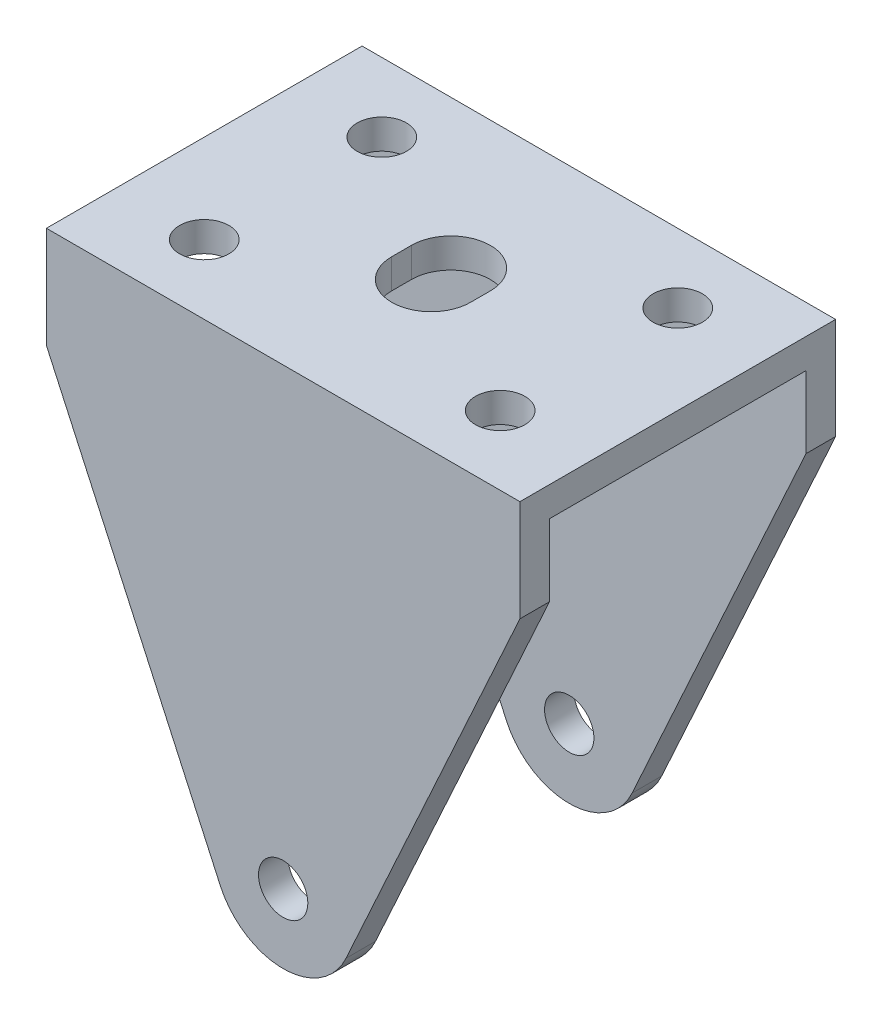
ISO-10303-21;
HEADER;
FILE_DESCRIPTION(('STEP AP214'),'2;1');
FILE_NAME('part.step','',(''),(''),'','','');
FILE_SCHEMA(('AUTOMOTIVE_DESIGN { 1 0 10303 214 1 1 1 1 }'));
ENDSEC;
DATA;
#1=APPLICATION_CONTEXT('core data for automotive mechanical design processes');
#2=APPLICATION_PROTOCOL_DEFINITION('international standard','automotive_design',2000,#1);
#3=PRODUCT_CONTEXT('',#1,'mechanical');
#4=PRODUCT('Part','Part','',(#3));
#5=PRODUCT_RELATED_PRODUCT_CATEGORY('part','',(#4));
#6=PRODUCT_DEFINITION_FORMATION('','',#4);
#7=PRODUCT_DEFINITION_CONTEXT('part definition',#1,'design');
#8=PRODUCT_DEFINITION('design','',#6,#7);
#9=PRODUCT_DEFINITION_SHAPE('','',#8);
#10=(LENGTH_UNIT() NAMED_UNIT(*) SI_UNIT(.MILLI.,.METRE.));
#11=(NAMED_UNIT(*) PLANE_ANGLE_UNIT() SI_UNIT($,.RADIAN.));
#12=(NAMED_UNIT(*) SI_UNIT($,.STERADIAN.) SOLID_ANGLE_UNIT());
#13=UNCERTAINTY_MEASURE_WITH_UNIT(LENGTH_MEASURE(1.E-05),#10,'distance_accuracy_value','');
#14=(GEOMETRIC_REPRESENTATION_CONTEXT(3) GLOBAL_UNCERTAINTY_ASSIGNED_CONTEXT((#13)) GLOBAL_UNIT_ASSIGNED_CONTEXT((#10,
#11,#12)) REPRESENTATION_CONTEXT('',''));
#15=CARTESIAN_POINT('',(0.,0.,0.));
#16=DIRECTION('',(0.,0.,1.));
#17=DIRECTION('',(1.,0.,0.));
#18=AXIS2_PLACEMENT_3D('',#15,#16,#17);
#19=CARTESIAN_POINT('',(24.,-3.,-16.));
#20=DIRECTION('',(0.,0.,-1.));
#21=DIRECTION('',(-1.,0.,0.));
#22=AXIS2_PLACEMENT_3D('',#19,#20,#21);
#23=PLANE('',#22);
#24=CARTESIAN_POINT('',(0.,-46.,-16.));
#25=DIRECTION('',(0.,0.,1.));
#26=DIRECTION('',(1.,0.,0.));
#27=AXIS2_PLACEMENT_3D('',#24,#25,#26);
#28=CIRCLE('',#27,2.5);
#29=CARTESIAN_POINT('',(2.5,-46.,-16.));
#30=VERTEX_POINT('',#29);
#31=EDGE_CURVE('E276',#30,#30,#28,.T.);
#32=ORIENTED_EDGE('',*,*,#31,.T.);
#33=EDGE_LOOP('',(#32));
#34=FACE_BOUND('',#33,.T.);
#35=CARTESIAN_POINT('',(0.,-46.,-16.));
#36=DIRECTION('',(0.,0.,1.));
#37=DIRECTION('',(1.,0.,0.));
#38=AXIS2_PLACEMENT_3D('',#35,#36,#37);
#39=CIRCLE('',#38,7.);
#40=CARTESIAN_POINT('',(-6.36773058240944,-48.9072336042787,-16.));
#41=VERTEX_POINT('',#40);
#42=CARTESIAN_POINT('',(6.36773058240945,-48.9072336042787,-16.));
#43=VERTEX_POINT('',#42);
#44=EDGE_CURVE('E299',#41,#43,#39,.T.);
#45=ORIENTED_EDGE('',*,*,#44,.F.);
#46=DIRECTION('',(0.415319086325528,-0.909675797487066,0.));
#47=VECTOR('',#46,1.);
#48=CARTESIAN_POINT('',(-23.746793751389,-10.8417710037272,-16.));
#49=LINE('',#48,#47);
#50=CARTESIAN_POINT('',(-24.,-10.2871718925432,-16.));
#51=VERTEX_POINT('',#50);
#52=EDGE_CURVE('E269',#51,#41,#49,.T.);
#53=ORIENTED_EDGE('',*,*,#52,.F.);
#54=DIRECTION('',(0.,1.,0.));
#55=VECTOR('',#54,1.);
#56=CARTESIAN_POINT('',(-24.,-3.,-16.));
#57=LINE('',#56,#55);
#58=CARTESIAN_POINT('',(-24.,0.,-16.));
#59=VERTEX_POINT('',#58);
#60=EDGE_CURVE('E366',#51,#59,#57,.T.);
#61=ORIENTED_EDGE('',*,*,#60,.T.);
#62=DIRECTION('',(-1.,0.,0.));
#63=VECTOR('',#62,1.);
#64=CARTESIAN_POINT('',(24.,0.,-16.));
#65=LINE('',#64,#63);
#66=CARTESIAN_POINT('',(24.,0.,-16.));
#67=VERTEX_POINT('',#66);
#68=EDGE_CURVE('E352',#67,#59,#65,.T.);
#69=ORIENTED_EDGE('',*,*,#68,.F.);
#70=DIRECTION('',(0.,1.,0.));
#71=VECTOR('',#70,1.);
#72=CARTESIAN_POINT('',(24.,-3.,-16.));
#73=LINE('',#72,#71);
#74=CARTESIAN_POINT('',(24.,-10.2871718925432,-16.));
#75=VERTEX_POINT('',#74);
#76=EDGE_CURVE('E368',#75,#67,#73,.T.);
#77=ORIENTED_EDGE('',*,*,#76,.F.);
#78=DIRECTION('',(-0.415319086325528,-0.909675797487066,0.));
#79=VECTOR('',#78,1.);
#80=CARTESIAN_POINT('',(23.746793751389,-10.8417710037272,-16.));
#81=LINE('',#80,#79);
#82=EDGE_CURVE('E301',#75,#43,#81,.T.);
#83=ORIENTED_EDGE('',*,*,#82,.T.);
#84=EDGE_LOOP('',(#45,#53,#61,#69,#77,#83));
#85=FACE_BOUND('',#84,.T.);
#86=ADVANCED_FACE('F93',(#34,#85),#23,.T.);
#87=CARTESIAN_POINT('',(24.,-3.,16.));
#88=DIRECTION('',(0.,0.,1.));
#89=DIRECTION('',(1.,0.,0.));
#90=AXIS2_PLACEMENT_3D('',#87,#88,#89);
#91=PLANE('',#90);
#92=CARTESIAN_POINT('',(0.,-46.,16.));
#93=DIRECTION('',(0.,0.,1.));
#94=DIRECTION('',(1.,0.,0.));
#95=AXIS2_PLACEMENT_3D('',#92,#93,#94);
#96=CIRCLE('',#95,2.5);
#97=CARTESIAN_POINT('',(2.5,-46.,16.));
#98=VERTEX_POINT('',#97);
#99=EDGE_CURVE('E295',#98,#98,#96,.T.);
#100=ORIENTED_EDGE('',*,*,#99,.F.);
#101=EDGE_LOOP('',(#100));
#102=FACE_BOUND('',#101,.T.);
#103=DIRECTION('',(0.415319086325528,-0.909675797487066,0.));
#104=VECTOR('',#103,1.);
#105=CARTESIAN_POINT('',(-24.,-10.2871718925432,16.));
#106=LINE('',#105,#104);
#107=CARTESIAN_POINT('',(-24.,-10.2871718925432,16.));
#108=VERTEX_POINT('',#107);
#109=CARTESIAN_POINT('',(-6.36773058240945,-48.9072336042787,16.));
#110=VERTEX_POINT('',#109);
#111=EDGE_CURVE('E97',#108,#110,#106,.T.);
#112=ORIENTED_EDGE('',*,*,#111,.T.);
#113=CARTESIAN_POINT('',(0.,-46.,16.));
#114=DIRECTION('',(0.,0.,1.));
#115=DIRECTION('',(1.,0.,0.));
#116=AXIS2_PLACEMENT_3D('',#113,#114,#115);
#117=CIRCLE('',#116,7.);
#118=CARTESIAN_POINT('',(6.36773058240945,-48.9072336042787,16.000006));
#119=VERTEX_POINT('',#118);
#120=EDGE_CURVE('E319',#110,#119,#117,.T.);
#121=ORIENTED_EDGE('',*,*,#120,.T.);
#122=DIRECTION('',(-0.415319086325528,-0.909675797487066,0.));
#123=VECTOR('',#122,1.);
#124=CARTESIAN_POINT('',(26.7531352313852,-4.25696386777377,16.));
#125=LINE('',#124,#123);
#126=CARTESIAN_POINT('',(24.,-10.2871718925432,16.));
#127=VERTEX_POINT('',#126);
#128=EDGE_CURVE('E327',#127,#119,#125,.T.);
#129=ORIENTED_EDGE('',*,*,#128,.F.);
#130=DIRECTION('',(0.,1.,0.));
#131=VECTOR('',#130,1.);
#132=CARTESIAN_POINT('',(24.,-3.,16.));
#133=LINE('',#132,#131);
#134=CARTESIAN_POINT('',(24.,0.,16.));
#135=VERTEX_POINT('',#134);
#136=EDGE_CURVE('E370',#127,#135,#133,.T.);
#137=ORIENTED_EDGE('',*,*,#136,.T.);
#138=DIRECTION('',(1.,0.,0.));
#139=VECTOR('',#138,1.);
#140=CARTESIAN_POINT('',(24.,0.,16.));
#141=LINE('',#140,#139);
#142=CARTESIAN_POINT('',(-24.,0.,16.));
#143=VERTEX_POINT('',#142);
#144=EDGE_CURVE('E358',#143,#135,#141,.T.);
#145=ORIENTED_EDGE('',*,*,#144,.F.);
#146=DIRECTION('',(0.,1.,0.));
#147=VECTOR('',#146,1.);
#148=CARTESIAN_POINT('',(-24.,-3.,16.));
#149=LINE('',#148,#147);
#150=EDGE_CURVE('E355',#108,#143,#149,.T.);
#151=ORIENTED_EDGE('',*,*,#150,.F.);
#152=EDGE_LOOP('',(#112,#121,#129,#137,#145,#151));
#153=FACE_BOUND('',#152,.T.);
#154=ADVANCED_FACE('F381',(#102,#153),#91,.T.);
#155=CARTESIAN_POINT('',(-24.,-53.,13.));
#156=DIRECTION('',(0.,0.,1.));
#157=DIRECTION('',(1.,0.,0.));
#158=AXIS2_PLACEMENT_3D('',#155,#156,#157);
#159=PLANE('',#158);
#160=CARTESIAN_POINT('',(0.,-46.,13.));
#161=DIRECTION('',(0.,0.,1.));
#162=DIRECTION('',(1.,0.,0.));
#163=AXIS2_PLACEMENT_3D('',#160,#161,#162);
#164=CIRCLE('',#163,2.5);
#165=CARTESIAN_POINT('',(2.5,-46.,13.));
#166=VERTEX_POINT('',#165);
#167=EDGE_CURVE('E292',#166,#166,#164,.T.);
#168=ORIENTED_EDGE('',*,*,#167,.T.);
#169=EDGE_LOOP('',(#168));
#170=FACE_BOUND('',#169,.T.);
#171=CARTESIAN_POINT('',(0.,-46.,13.));
#172=DIRECTION('',(0.,0.,1.));
#173=DIRECTION('',(1.,0.,0.));
#174=AXIS2_PLACEMENT_3D('',#171,#172,#173);
#175=CIRCLE('',#174,7.);
#176=CARTESIAN_POINT('',(-6.36773058240944,-48.9072336042787,13.));
#177=VERTEX_POINT('',#176);
#178=CARTESIAN_POINT('',(6.36773058240945,-48.9072336042787,13.));
#179=VERTEX_POINT('',#178);
#180=EDGE_CURVE('E317',#177,#179,#175,.T.);
#181=ORIENTED_EDGE('',*,*,#180,.F.);
#182=DIRECTION('',(0.415319086325528,-0.909675797487066,0.));
#183=VECTOR('',#182,1.);
#184=CARTESIAN_POINT('',(-7.86284917814653,-45.6324666944602,13.));
#185=LINE('',#184,#183);
#186=CARTESIAN_POINT('',(-24.,-10.2871718925432,13.));
#187=VERTEX_POINT('',#186);
#188=EDGE_CURVE('E289',#187,#177,#185,.T.);
#189=ORIENTED_EDGE('',*,*,#188,.F.);
#190=DIRECTION('',(0.,1.,0.));
#191=VECTOR('',#190,1.);
#192=CARTESIAN_POINT('',(-24.,-53.,13.));
#193=LINE('',#192,#191);
#194=CARTESIAN_POINT('',(-24.,-3.,13.));
#195=VERTEX_POINT('',#194);
#196=EDGE_CURVE('E345',#187,#195,#193,.T.);
#197=ORIENTED_EDGE('',*,*,#196,.T.);
#198=DIRECTION('',(1.,0.,0.));
#199=VECTOR('',#198,1.);
#200=CARTESIAN_POINT('',(-24.,-3.,13.));
#201=LINE('',#200,#199);
#202=CARTESIAN_POINT('',(24.,-3.,13.));
#203=VERTEX_POINT('',#202);
#204=EDGE_CURVE('E340',#195,#203,#201,.T.);
#205=ORIENTED_EDGE('',*,*,#204,.T.);
#206=DIRECTION('',(0.,1.,0.));
#207=VECTOR('',#206,1.);
#208=CARTESIAN_POINT('',(24.,-53.,13.));
#209=LINE('',#208,#207);
#210=CARTESIAN_POINT('',(24.,-10.2871718925432,13.));
#211=VERTEX_POINT('',#210);
#212=EDGE_CURVE('E343',#211,#203,#209,.T.);
#213=ORIENTED_EDGE('',*,*,#212,.F.);
#214=DIRECTION('',(-0.415319086325528,-0.909675797487066,0.));
#215=VECTOR('',#214,1.);
#216=CARTESIAN_POINT('',(-0.416668108234486,-63.7671413055694,13.));
#217=LINE('',#216,#215);
#218=EDGE_CURVE('E322',#211,#179,#217,.T.);
#219=ORIENTED_EDGE('',*,*,#218,.T.);
#220=EDGE_LOOP('',(#181,#189,#197,#205,#213,#219));
#221=FACE_BOUND('',#220,.T.);
#222=ADVANCED_FACE('F395',(#170,#221),#159,.F.);
#223=CARTESIAN_POINT('',(-24.,-53.,-13.));
#224=DIRECTION('',(0.,0.,-1.));
#225=DIRECTION('',(-1.,0.,0.));
#226=AXIS2_PLACEMENT_3D('',#223,#224,#225);
#227=PLANE('',#226);
#228=CARTESIAN_POINT('',(0.,-46.,-13.));
#229=DIRECTION('',(0.,0.,-1.));
#230=DIRECTION('',(-1.,0.,0.));
#231=AXIS2_PLACEMENT_3D('',#228,#229,#230);
#232=CIRCLE('',#231,2.5);
#233=CARTESIAN_POINT('',(-2.5,-46.,-13.));
#234=VERTEX_POINT('',#233);
#235=EDGE_CURVE('E296',#234,#234,#232,.T.);
#236=ORIENTED_EDGE('',*,*,#235,.T.);
#237=EDGE_LOOP('',(#236));
#238=FACE_BOUND('',#237,.T.);
#239=DIRECTION('',(-0.415319086325528,0.909675797487066,0.));
#240=VECTOR('',#239,1.);
#241=CARTESIAN_POINT('',(-7.86284917814653,-45.6324666944602,-13.));
#242=LINE('',#241,#240);
#243=CARTESIAN_POINT('',(-6.36773058240944,-48.9072336042787,-13.));
#244=VERTEX_POINT('',#243);
#245=CARTESIAN_POINT('',(-24.,-10.2871718925432,-13.));
#246=VERTEX_POINT('',#245);
#247=EDGE_CURVE('E287',#244,#246,#242,.T.);
#248=ORIENTED_EDGE('',*,*,#247,.F.);
#249=CARTESIAN_POINT('',(0.,-46.,-13.));
#250=DIRECTION('',(0.,0.,-1.));
#251=DIRECTION('',(-1.,0.,0.));
#252=AXIS2_PLACEMENT_3D('',#249,#250,#251);
#253=CIRCLE('',#252,7.);
#254=CARTESIAN_POINT('',(6.36773058240945,-48.9072336042787,-13.));
#255=VERTEX_POINT('',#254);
#256=EDGE_CURVE('E315',#255,#244,#253,.T.);
#257=ORIENTED_EDGE('',*,*,#256,.F.);
#258=DIRECTION('',(0.415319086325528,0.909675797487066,0.));
#259=VECTOR('',#258,1.);
#260=CARTESIAN_POINT('',(-0.416668108234486,-63.7671413055694,-13.));
#261=LINE('',#260,#259);
#262=CARTESIAN_POINT('',(24.,-10.2871718925432,-13.));
#263=VERTEX_POINT('',#262);
#264=EDGE_CURVE('E102',#255,#263,#261,.T.);
#265=ORIENTED_EDGE('',*,*,#264,.T.);
#266=DIRECTION('',(0.,1.,0.));
#267=VECTOR('',#266,1.);
#268=CARTESIAN_POINT('',(24.,-53.,-13.));
#269=LINE('',#268,#267);
#270=CARTESIAN_POINT('',(24.,-3.,-13.));
#271=VERTEX_POINT('',#270);
#272=EDGE_CURVE('E338',#263,#271,#269,.T.);
#273=ORIENTED_EDGE('',*,*,#272,.T.);
#274=DIRECTION('',(-1.,0.,0.));
#275=VECTOR('',#274,1.);
#276=CARTESIAN_POINT('',(-24.,-3.,-13.));
#277=LINE('',#276,#275);
#278=CARTESIAN_POINT('',(-24.,-3.,-13.));
#279=VERTEX_POINT('',#278);
#280=EDGE_CURVE('E329',#271,#279,#277,.T.);
#281=ORIENTED_EDGE('',*,*,#280,.T.);
#282=DIRECTION('',(0.,1.,0.));
#283=VECTOR('',#282,1.);
#284=CARTESIAN_POINT('',(-24.,-53.,-13.));
#285=LINE('',#284,#283);
#286=EDGE_CURVE('E336',#246,#279,#285,.T.);
#287=ORIENTED_EDGE('',*,*,#286,.F.);
#288=EDGE_LOOP('',(#248,#257,#265,#273,#281,#287));
#289=FACE_BOUND('',#288,.T.);
#290=ADVANCED_FACE('F415',(#238,#289),#227,.F.);
#291=CARTESIAN_POINT('',(-24.,-3.,16.));
#292=DIRECTION('',(-1.,0.,0.));
#293=DIRECTION('',(0.,0.,1.));
#294=AXIS2_PLACEMENT_3D('',#291,#292,#293);
#295=PLANE('',#294);
#296=ORIENTED_EDGE('',*,*,#60,.F.);
#297=DIRECTION('',(0.,0.,1.));
#298=VECTOR('',#297,1.);
#299=CARTESIAN_POINT('',(-24.,-10.2871718925432,-16.));
#300=LINE('',#299,#298);
#301=EDGE_CURVE('E273',#51,#246,#300,.T.);
#302=ORIENTED_EDGE('',*,*,#301,.T.);
#303=ORIENTED_EDGE('',*,*,#286,.T.);
#304=DIRECTION('',(0.,0.,1.));
#305=VECTOR('',#304,1.);
#306=CARTESIAN_POINT('',(-24.,-3.,16.));
#307=LINE('',#306,#305);
#308=EDGE_CURVE('E348',#279,#195,#307,.T.);
#309=ORIENTED_EDGE('',*,*,#308,.T.);
#310=ORIENTED_EDGE('',*,*,#196,.F.);
#311=DIRECTION('',(0.,0.,1.));
#312=VECTOR('',#311,1.);
#313=CARTESIAN_POINT('',(-24.,-10.2871718925432,16.));
#314=LINE('',#313,#312);
#315=EDGE_CURVE('E12',#187,#108,#314,.T.);
#316=ORIENTED_EDGE('',*,*,#315,.T.);
#317=ORIENTED_EDGE('',*,*,#150,.T.);
#318=DIRECTION('',(0.,0.,1.));
#319=VECTOR('',#318,1.);
#320=CARTESIAN_POINT('',(-24.,0.,16.));
#321=LINE('',#320,#319);
#322=EDGE_CURVE('E347',#59,#143,#321,.T.);
#323=ORIENTED_EDGE('',*,*,#322,.F.);
#324=EDGE_LOOP('',(#296,#302,#303,#309,#310,#316,#317,#323));
#325=FACE_BOUND('',#324,.T.);
#326=ADVANCED_FACE('F95',(#325),#295,.T.);
#327=CARTESIAN_POINT('',(0.,-3.,0.));
#328=DIRECTION('',(0.,1.,0.));
#329=DIRECTION('',(0.,0.,1.));
#330=AXIS2_PLACEMENT_3D('',#327,#328,#329);
#331=PLANE('',#330);
#332=DIRECTION('',(0.,0.,-1.));
#333=VECTOR('',#332,1.);
#334=CARTESIAN_POINT('',(4.,-3.,0.));
#335=LINE('',#334,#333);
#336=CARTESIAN_POINT('',(4.,-3.,1.));
#337=VERTEX_POINT('',#336);
#338=CARTESIAN_POINT('',(4.,-3.,-1.));
#339=VERTEX_POINT('',#338);
#340=EDGE_CURVE('E239',#337,#339,#335,.T.);
#341=ORIENTED_EDGE('',*,*,#340,.T.);
#342=CARTESIAN_POINT('',(0.,-3.,-1.));
#343=DIRECTION('',(0.,1.,0.));
#344=DIRECTION('',(0.,0.,1.));
#345=AXIS2_PLACEMENT_3D('',#342,#343,#344);
#346=CIRCLE('',#345,4.);
#347=CARTESIAN_POINT('',(-4.,-3.,-1.));
#348=VERTEX_POINT('',#347);
#349=EDGE_CURVE('E242',#339,#348,#346,.T.);
#350=ORIENTED_EDGE('',*,*,#349,.T.);
#351=DIRECTION('',(0.,0.,1.));
#352=VECTOR('',#351,1.);
#353=CARTESIAN_POINT('',(-4.,-3.,0.));
#354=LINE('',#353,#352);
#355=CARTESIAN_POINT('',(-4.,-3.,1.));
#356=VERTEX_POINT('',#355);
#357=EDGE_CURVE('E234',#348,#356,#354,.T.);
#358=ORIENTED_EDGE('',*,*,#357,.T.);
#359=CARTESIAN_POINT('',(0.,-3.,1.));
#360=DIRECTION('',(0.,1.,0.));
#361=DIRECTION('',(0.,0.,1.));
#362=AXIS2_PLACEMENT_3D('',#359,#360,#361);
#363=CIRCLE('',#362,4.);
#364=EDGE_CURVE('E214',#356,#337,#363,.T.);
#365=ORIENTED_EDGE('',*,*,#364,.T.);
#366=EDGE_LOOP('',(#341,#350,#358,#365));
#367=FACE_BOUND('',#366,.T.);
#368=CARTESIAN_POINT('',(-15.,-3.,8.99999999999999));
#369=DIRECTION('',(0.,1.,0.));
#370=DIRECTION('',(0.,0.,1.));
#371=AXIS2_PLACEMENT_3D('',#368,#369,#370);
#372=CIRCLE('',#371,2.49999999999999);
#373=CARTESIAN_POINT('',(-15.,-3.,11.5));
#374=VERTEX_POINT('',#373);
#375=EDGE_CURVE('E248',#374,#374,#372,.T.);
#376=ORIENTED_EDGE('',*,*,#375,.T.);
#377=EDGE_LOOP('',(#376));
#378=FACE_BOUND('',#377,.T.);
#379=CARTESIAN_POINT('',(-15.,-3.,-9.));
#380=DIRECTION('',(0.,1.,0.));
#381=DIRECTION('',(0.,0.,1.));
#382=AXIS2_PLACEMENT_3D('',#379,#380,#381);
#383=CIRCLE('',#382,2.49999999999999);
#384=CARTESIAN_POINT('',(-15.,-3.,-6.50000000000001));
#385=VERTEX_POINT('',#384);
#386=EDGE_CURVE('E254',#385,#385,#383,.T.);
#387=ORIENTED_EDGE('',*,*,#386,.T.);
#388=EDGE_LOOP('',(#387));
#389=FACE_BOUND('',#388,.T.);
#390=CARTESIAN_POINT('',(15.,-3.,-9.));
#391=DIRECTION('',(0.,1.,0.));
#392=DIRECTION('',(0.,0.,1.));
#393=AXIS2_PLACEMENT_3D('',#390,#391,#392);
#394=CIRCLE('',#393,2.49999999999999);
#395=CARTESIAN_POINT('',(15.,-3.,-6.50000000000001));
#396=VERTEX_POINT('',#395);
#397=EDGE_CURVE('E260',#396,#396,#394,.T.);
#398=ORIENTED_EDGE('',*,*,#397,.T.);
#399=EDGE_LOOP('',(#398));
#400=FACE_BOUND('',#399,.T.);
#401=CARTESIAN_POINT('',(15.,-3.,8.99999999999999));
#402=DIRECTION('',(0.,1.,0.));
#403=DIRECTION('',(0.,0.,1.));
#404=AXIS2_PLACEMENT_3D('',#401,#402,#403);
#405=CIRCLE('',#404,2.49999999999999);
#406=CARTESIAN_POINT('',(15.,-3.,11.5));
#407=VERTEX_POINT('',#406);
#408=EDGE_CURVE('E266',#407,#407,#405,.T.);
#409=ORIENTED_EDGE('',*,*,#408,.T.);
#410=EDGE_LOOP('',(#409));
#411=FACE_BOUND('',#410,.T.);
#412=ORIENTED_EDGE('',*,*,#280,.F.);
#413=DIRECTION('',(0.,0.,-1.));
#414=VECTOR('',#413,1.);
#415=CARTESIAN_POINT('',(24.,-3.,16.));
#416=LINE('',#415,#414);
#417=EDGE_CURVE('E351',#203,#271,#416,.T.);
#418=ORIENTED_EDGE('',*,*,#417,.F.);
#419=ORIENTED_EDGE('',*,*,#204,.F.);
#420=ORIENTED_EDGE('',*,*,#308,.F.);
#421=EDGE_LOOP('',(#412,#418,#419,#420));
#422=FACE_BOUND('',#421,.T.);
#423=ADVANCED_FACE('F411',(#367,#378,#389,#400,#411,#422),#331,.F.);
#424=CARTESIAN_POINT('',(24.,-3.,16.));
#425=DIRECTION('',(1.,0.,0.));
#426=DIRECTION('',(0.,0.,-1.));
#427=AXIS2_PLACEMENT_3D('',#424,#425,#426);
#428=PLANE('',#427);
#429=DIRECTION('',(0.,0.,1.));
#430=VECTOR('',#429,1.);
#431=CARTESIAN_POINT('',(24.,-10.2871718925432,-16.));
#432=LINE('',#431,#430);
#433=EDGE_CURVE('E305',#75,#263,#432,.T.);
#434=ORIENTED_EDGE('',*,*,#433,.F.);
#435=ORIENTED_EDGE('',*,*,#76,.T.);
#436=DIRECTION('',(0.,0.,-1.));
#437=VECTOR('',#436,1.);
#438=CARTESIAN_POINT('',(24.,0.,16.));
#439=LINE('',#438,#437);
#440=EDGE_CURVE('E361',#135,#67,#439,.T.);
#441=ORIENTED_EDGE('',*,*,#440,.F.);
#442=ORIENTED_EDGE('',*,*,#136,.F.);
#443=EDGE_CURVE('E304',#211,#127,#432,.T.);
#444=ORIENTED_EDGE('',*,*,#443,.F.);
#445=ORIENTED_EDGE('',*,*,#212,.T.);
#446=ORIENTED_EDGE('',*,*,#417,.T.);
#447=ORIENTED_EDGE('',*,*,#272,.F.);
#448=EDGE_LOOP('',(#434,#435,#441,#442,#444,#445,#446,#447));
#449=FACE_BOUND('',#448,.T.);
#450=ADVANCED_FACE('F406',(#449),#428,.T.);
#451=CARTESIAN_POINT('',(0.,0.,0.));
#452=DIRECTION('',(0.,1.,0.));
#453=DIRECTION('',(0.,0.,1.));
#454=AXIS2_PLACEMENT_3D('',#451,#452,#453);
#455=PLANE('',#454);
#456=CARTESIAN_POINT('',(0.,0.,-1.));
#457=DIRECTION('',(0.,1.,0.));
#458=DIRECTION('',(0.,0.,1.));
#459=AXIS2_PLACEMENT_3D('',#456,#457,#458);
#460=CIRCLE('',#459,4.);
#461=CARTESIAN_POINT('',(4.,0.,-1.));
#462=VERTEX_POINT('',#461);
#463=CARTESIAN_POINT('',(-4.,0.,-1.));
#464=VERTEX_POINT('',#463);
#465=EDGE_CURVE('E118',#462,#464,#460,.T.);
#466=ORIENTED_EDGE('',*,*,#465,.F.);
#467=DIRECTION('',(0.,0.,-1.));
#468=VECTOR('',#467,1.);
#469=CARTESIAN_POINT('',(4.,0.,-1.));
#470=LINE('',#469,#468);
#471=CARTESIAN_POINT('',(4.,0.,1.));
#472=VERTEX_POINT('',#471);
#473=EDGE_CURVE('E227',#472,#462,#470,.T.);
#474=ORIENTED_EDGE('',*,*,#473,.F.);
#475=CARTESIAN_POINT('',(0.,0.,1.));
#476=DIRECTION('',(0.,1.,0.));
#477=DIRECTION('',(0.,0.,-1.));
#478=AXIS2_PLACEMENT_3D('',#475,#476,#477);
#479=CIRCLE('',#478,4.);
#480=CARTESIAN_POINT('',(-4.,0.,1.));
#481=VERTEX_POINT('',#480);
#482=EDGE_CURVE('E211',#481,#472,#479,.T.);
#483=ORIENTED_EDGE('',*,*,#482,.F.);
#484=DIRECTION('',(0.,0.,1.));
#485=VECTOR('',#484,1.);
#486=CARTESIAN_POINT('',(-4.,0.,-1.));
#487=LINE('',#486,#485);
#488=EDGE_CURVE('E220',#464,#481,#487,.T.);
#489=ORIENTED_EDGE('',*,*,#488,.F.);
#490=EDGE_LOOP('',(#466,#474,#483,#489));
#491=FACE_BOUND('',#490,.T.);
#492=CARTESIAN_POINT('',(-15.,0.,8.99999999999999));
#493=DIRECTION('',(0.,1.,0.));
#494=DIRECTION('',(0.,0.,1.));
#495=AXIS2_PLACEMENT_3D('',#492,#493,#494);
#496=CIRCLE('',#495,2.49999999999999);
#497=CARTESIAN_POINT('',(-15.,0.,11.5));
#498=VERTEX_POINT('',#497);
#499=EDGE_CURVE('E245',#498,#498,#496,.T.);
#500=ORIENTED_EDGE('',*,*,#499,.F.);
#501=EDGE_LOOP('',(#500));
#502=FACE_BOUND('',#501,.T.);
#503=CARTESIAN_POINT('',(-15.,0.,-9.));
#504=DIRECTION('',(0.,1.,0.));
#505=DIRECTION('',(0.,0.,1.));
#506=AXIS2_PLACEMENT_3D('',#503,#504,#505);
#507=CIRCLE('',#506,2.49999999999999);
#508=CARTESIAN_POINT('',(-15.,0.,-6.50000000000001));
#509=VERTEX_POINT('',#508);
#510=EDGE_CURVE('E251',#509,#509,#507,.T.);
#511=ORIENTED_EDGE('',*,*,#510,.F.);
#512=EDGE_LOOP('',(#511));
#513=FACE_BOUND('',#512,.T.);
#514=CARTESIAN_POINT('',(15.,0.,-9.));
#515=DIRECTION('',(0.,1.,0.));
#516=DIRECTION('',(0.,0.,1.));
#517=AXIS2_PLACEMENT_3D('',#514,#515,#516);
#518=CIRCLE('',#517,2.49999999999999);
#519=CARTESIAN_POINT('',(15.,0.,-6.50000000000001));
#520=VERTEX_POINT('',#519);
#521=EDGE_CURVE('E257',#520,#520,#518,.T.);
#522=ORIENTED_EDGE('',*,*,#521,.F.);
#523=EDGE_LOOP('',(#522));
#524=FACE_BOUND('',#523,.T.);
#525=CARTESIAN_POINT('',(15.,0.,8.99999999999999));
#526=DIRECTION('',(0.,1.,0.));
#527=DIRECTION('',(0.,0.,1.));
#528=AXIS2_PLACEMENT_3D('',#525,#526,#527);
#529=CIRCLE('',#528,2.49999999999999);
#530=CARTESIAN_POINT('',(15.,0.,11.5));
#531=VERTEX_POINT('',#530);
#532=EDGE_CURVE('E263',#531,#531,#529,.T.);
#533=ORIENTED_EDGE('',*,*,#532,.F.);
#534=EDGE_LOOP('',(#533));
#535=FACE_BOUND('',#534,.T.);
#536=ORIENTED_EDGE('',*,*,#322,.T.);
#537=ORIENTED_EDGE('',*,*,#144,.T.);
#538=ORIENTED_EDGE('',*,*,#440,.T.);
#539=ORIENTED_EDGE('',*,*,#68,.T.);
#540=EDGE_LOOP('',(#536,#537,#538,#539));
#541=FACE_BOUND('',#540,.T.);
#542=ADVANCED_FACE('F224',(#491,#502,#513,#524,#535,#541),#455,.T.);
#543=CARTESIAN_POINT('',(0.,-46.,-16.));
#544=DIRECTION('',(0.,0.,1.));
#545=DIRECTION('',(1.,0.,0.));
#546=AXIS2_PLACEMENT_3D('',#543,#544,#545);
#547=CYLINDRICAL_SURFACE('',#546,7.);
#548=ORIENTED_EDGE('',*,*,#256,.T.);
#549=DIRECTION('',(0.,0.,1.));
#550=VECTOR('',#549,1.);
#551=CARTESIAN_POINT('',(-6.36773058240944,-48.9072336042787,-16.));
#552=LINE('',#551,#550);
#553=EDGE_CURVE('E277',#41,#244,#552,.T.);
#554=ORIENTED_EDGE('',*,*,#553,.F.);
#555=ORIENTED_EDGE('',*,*,#44,.T.);
#556=DIRECTION('',(0.,0.,1.));
#557=VECTOR('',#556,1.);
#558=CARTESIAN_POINT('',(6.36773058240945,-48.9072336042787,-16.));
#559=LINE('',#558,#557);
#560=EDGE_CURVE('E310',#43,#255,#559,.T.);
#561=ORIENTED_EDGE('',*,*,#560,.T.);
#562=EDGE_LOOP('',(#548,#554,#555,#561));
#563=FACE_BOUND('',#562,.T.);
#564=ADVANCED_FACE('F431',(#563),#547,.T.);
#565=CARTESIAN_POINT('',(23.746793751389,-10.8417710037272,-16.));
#566=DIRECTION('',(-0.909675797487066,0.415319086325528,0.));
#567=DIRECTION('',(-0.415319086325528,-0.909675797487066,0.));
#568=AXIS2_PLACEMENT_3D('',#565,#566,#567);
#569=PLANE('',#568);
#570=ORIENTED_EDGE('',*,*,#560,.F.);
#571=ORIENTED_EDGE('',*,*,#82,.F.);
#572=ORIENTED_EDGE('',*,*,#433,.T.);
#573=ORIENTED_EDGE('',*,*,#264,.F.);
#574=EDGE_LOOP('',(#570,#571,#572,#573));
#575=FACE_BOUND('',#574,.T.);
#576=ADVANCED_FACE('F432',(#575),#569,.F.);
#577=ORIENTED_EDGE('',*,*,#128,.T.);
#578=EDGE_CURVE('E307',#179,#119,#559,.T.);
#579=ORIENTED_EDGE('',*,*,#578,.F.);
#580=ORIENTED_EDGE('',*,*,#218,.F.);
#581=ORIENTED_EDGE('',*,*,#443,.T.);
#582=EDGE_LOOP('',(#577,#579,#580,#581));
#583=FACE_BOUND('',#582,.T.);
#584=ADVANCED_FACE('F401',(#583),#569,.F.);
#585=ORIENTED_EDGE('',*,*,#120,.F.);
#586=EDGE_CURVE('E272',#177,#110,#552,.T.);
#587=ORIENTED_EDGE('',*,*,#586,.F.);
#588=ORIENTED_EDGE('',*,*,#180,.T.);
#589=ORIENTED_EDGE('',*,*,#578,.T.);
#590=EDGE_LOOP('',(#585,#587,#588,#589));
#591=FACE_BOUND('',#590,.T.);
#592=ADVANCED_FACE('F398',(#591),#547,.T.);
#593=CARTESIAN_POINT('',(-23.746793751389,-10.8417710037272,-16.));
#594=DIRECTION('',(-0.909675797487066,-0.415319086325528,0.));
#595=DIRECTION('',(0.415319086325528,-0.909675797487066,0.));
#596=AXIS2_PLACEMENT_3D('',#593,#594,#595);
#597=PLANE('',#596);
#598=ORIENTED_EDGE('',*,*,#315,.F.);
#599=ORIENTED_EDGE('',*,*,#188,.T.);
#600=ORIENTED_EDGE('',*,*,#586,.T.);
#601=ORIENTED_EDGE('',*,*,#111,.F.);
#602=EDGE_LOOP('',(#598,#599,#600,#601));
#603=FACE_BOUND('',#602,.T.);
#604=ADVANCED_FACE('F385',(#603),#597,.T.);
#605=ORIENTED_EDGE('',*,*,#247,.T.);
#606=ORIENTED_EDGE('',*,*,#301,.F.);
#607=ORIENTED_EDGE('',*,*,#52,.T.);
#608=ORIENTED_EDGE('',*,*,#553,.T.);
#609=EDGE_LOOP('',(#605,#606,#607,#608));
#610=FACE_BOUND('',#609,.T.);
#611=ADVANCED_FACE('F426',(#610),#597,.T.);
#612=CARTESIAN_POINT('',(0.,-46.,-16.));
#613=DIRECTION('',(0.,0.,1.));
#614=DIRECTION('',(1.,0.,0.));
#615=AXIS2_PLACEMENT_3D('',#612,#613,#614);
#616=CYLINDRICAL_SURFACE('',#615,2.5);
#617=ORIENTED_EDGE('',*,*,#31,.F.);
#618=EDGE_LOOP('',(#617));
#619=FACE_BOUND('',#618,.T.);
#620=ORIENTED_EDGE('',*,*,#235,.F.);
#621=EDGE_LOOP('',(#620));
#622=FACE_BOUND('',#621,.T.);
#623=ADVANCED_FACE('F476',(#619,#622),#616,.F.);
#624=ORIENTED_EDGE('',*,*,#99,.T.);
#625=EDGE_LOOP('',(#624));
#626=FACE_BOUND('',#625,.T.);
#627=ORIENTED_EDGE('',*,*,#167,.F.);
#628=EDGE_LOOP('',(#627));
#629=FACE_BOUND('',#628,.T.);
#630=ADVANCED_FACE('F480',(#626,#629),#616,.F.);
#631=CARTESIAN_POINT('',(15.,0.,8.99999999999999));
#632=DIRECTION('',(0.,1.,0.));
#633=DIRECTION('',(0.,0.,1.));
#634=AXIS2_PLACEMENT_3D('',#631,#632,#633);
#635=CYLINDRICAL_SURFACE('',#634,2.49999999999999);
#636=ORIENTED_EDGE('',*,*,#532,.T.);
#637=EDGE_LOOP('',(#636));
#638=FACE_BOUND('',#637,.T.);
#639=ORIENTED_EDGE('',*,*,#408,.F.);
#640=EDGE_LOOP('',(#639));
#641=FACE_BOUND('',#640,.T.);
#642=ADVANCED_FACE('F478',(#638,#641),#635,.F.);
#643=CARTESIAN_POINT('',(15.,0.,-9.));
#644=DIRECTION('',(0.,1.,0.));
#645=DIRECTION('',(0.,0.,1.));
#646=AXIS2_PLACEMENT_3D('',#643,#644,#645);
#647=CYLINDRICAL_SURFACE('',#646,2.49999999999999);
#648=ORIENTED_EDGE('',*,*,#521,.T.);
#649=EDGE_LOOP('',(#648));
#650=FACE_BOUND('',#649,.T.);
#651=ORIENTED_EDGE('',*,*,#397,.F.);
#652=EDGE_LOOP('',(#651));
#653=FACE_BOUND('',#652,.T.);
#654=ADVANCED_FACE('F487',(#650,#653),#647,.F.);
#655=CARTESIAN_POINT('',(-15.,0.,-9.));
#656=DIRECTION('',(0.,1.,0.));
#657=DIRECTION('',(0.,0.,1.));
#658=AXIS2_PLACEMENT_3D('',#655,#656,#657);
#659=CYLINDRICAL_SURFACE('',#658,2.49999999999999);
#660=ORIENTED_EDGE('',*,*,#510,.T.);
#661=EDGE_LOOP('',(#660));
#662=FACE_BOUND('',#661,.T.);
#663=ORIENTED_EDGE('',*,*,#386,.F.);
#664=EDGE_LOOP('',(#663));
#665=FACE_BOUND('',#664,.T.);
#666=ADVANCED_FACE('F628',(#662,#665),#659,.F.);
#667=CARTESIAN_POINT('',(-15.,0.,8.99999999999999));
#668=DIRECTION('',(0.,1.,0.));
#669=DIRECTION('',(0.,0.,1.));
#670=AXIS2_PLACEMENT_3D('',#667,#668,#669);
#671=CYLINDRICAL_SURFACE('',#670,2.49999999999999);
#672=ORIENTED_EDGE('',*,*,#499,.T.);
#673=EDGE_LOOP('',(#672));
#674=FACE_BOUND('',#673,.T.);
#675=ORIENTED_EDGE('',*,*,#375,.F.);
#676=EDGE_LOOP('',(#675));
#677=FACE_BOUND('',#676,.T.);
#678=ADVANCED_FACE('F595',(#674,#677),#671,.F.);
#679=CARTESIAN_POINT('',(0.,-7.,-1.));
#680=DIRECTION('',(0.,1.,0.));
#681=DIRECTION('',(0.,0.,1.));
#682=AXIS2_PLACEMENT_3D('',#679,#680,#681);
#683=CYLINDRICAL_SURFACE('',#682,4.);
#684=DIRECTION('',(0.,1.,0.));
#685=VECTOR('',#684,1.);
#686=CARTESIAN_POINT('',(4.,-7.,-1.));
#687=LINE('',#686,#685);
#688=EDGE_CURVE('E232',#339,#462,#687,.T.);
#689=ORIENTED_EDGE('',*,*,#688,.T.);
#690=ORIENTED_EDGE('',*,*,#465,.T.);
#691=DIRECTION('',(0.,1.,0.));
#692=VECTOR('',#691,1.);
#693=CARTESIAN_POINT('',(-4.,-7.,-1.));
#694=LINE('',#693,#692);
#695=EDGE_CURVE('E217',#348,#464,#694,.T.);
#696=ORIENTED_EDGE('',*,*,#695,.F.);
#697=ORIENTED_EDGE('',*,*,#349,.F.);
#698=EDGE_LOOP('',(#689,#690,#696,#697));
#699=FACE_BOUND('',#698,.T.);
#700=ADVANCED_FACE('F589',(#699),#683,.F.);
#701=CARTESIAN_POINT('',(4.,-7.,-1.));
#702=DIRECTION('',(1.,0.,0.));
#703=DIRECTION('',(0.,0.,-1.));
#704=AXIS2_PLACEMENT_3D('',#701,#702,#703);
#705=PLANE('',#704);
#706=DIRECTION('',(0.,1.,0.));
#707=VECTOR('',#706,1.);
#708=CARTESIAN_POINT('',(4.,-7.,1.));
#709=LINE('',#708,#707);
#710=EDGE_CURVE('E216',#337,#472,#709,.T.);
#711=ORIENTED_EDGE('',*,*,#710,.T.);
#712=ORIENTED_EDGE('',*,*,#473,.T.);
#713=ORIENTED_EDGE('',*,*,#688,.F.);
#714=ORIENTED_EDGE('',*,*,#340,.F.);
#715=EDGE_LOOP('',(#711,#712,#713,#714));
#716=FACE_BOUND('',#715,.T.);
#717=ADVANCED_FACE('F594',(#716),#705,.F.);
#718=CARTESIAN_POINT('',(0.,-7.,1.));
#719=DIRECTION('',(0.,1.,0.));
#720=DIRECTION('',(0.,0.,1.));
#721=AXIS2_PLACEMENT_3D('',#718,#719,#720);
#722=CYLINDRICAL_SURFACE('',#721,4.);
#723=DIRECTION('',(0.,1.,0.));
#724=VECTOR('',#723,1.);
#725=CARTESIAN_POINT('',(-4.,-7.,1.));
#726=LINE('',#725,#724);
#727=EDGE_CURVE('E110',#356,#481,#726,.T.);
#728=ORIENTED_EDGE('',*,*,#727,.T.);
#729=ORIENTED_EDGE('',*,*,#482,.T.);
#730=ORIENTED_EDGE('',*,*,#710,.F.);
#731=ORIENTED_EDGE('',*,*,#364,.F.);
#732=EDGE_LOOP('',(#728,#729,#730,#731));
#733=FACE_BOUND('',#732,.T.);
#734=ADVANCED_FACE('F208',(#733),#722,.F.);
#735=CARTESIAN_POINT('',(-4.,-7.,-1.));
#736=DIRECTION('',(-1.,0.,0.));
#737=DIRECTION('',(0.,0.,1.));
#738=AXIS2_PLACEMENT_3D('',#735,#736,#737);
#739=PLANE('',#738);
#740=ORIENTED_EDGE('',*,*,#695,.T.);
#741=ORIENTED_EDGE('',*,*,#488,.T.);
#742=ORIENTED_EDGE('',*,*,#727,.F.);
#743=ORIENTED_EDGE('',*,*,#357,.F.);
#744=EDGE_LOOP('',(#740,#741,#742,#743));
#745=FACE_BOUND('',#744,.T.);
#746=ADVANCED_FACE('F221',(#745),#739,.F.);
#747=CLOSED_SHELL('',(#86,#154,#222,#290,#326,#423,#450,#542,#564,#576,#584,#592,#604,#611,#623,
#630,#642,#654,#666,#678,#700,#717,#734,#746));
#748=MANIFOLD_SOLID_BREP('B2',#747);
#749=ADVANCED_BREP_SHAPE_REPRESENTATION('',(#18,#748),#14);
#750=SHAPE_DEFINITION_REPRESENTATION(#9,#749);
ENDSEC;
END-ISO-10303-21;
